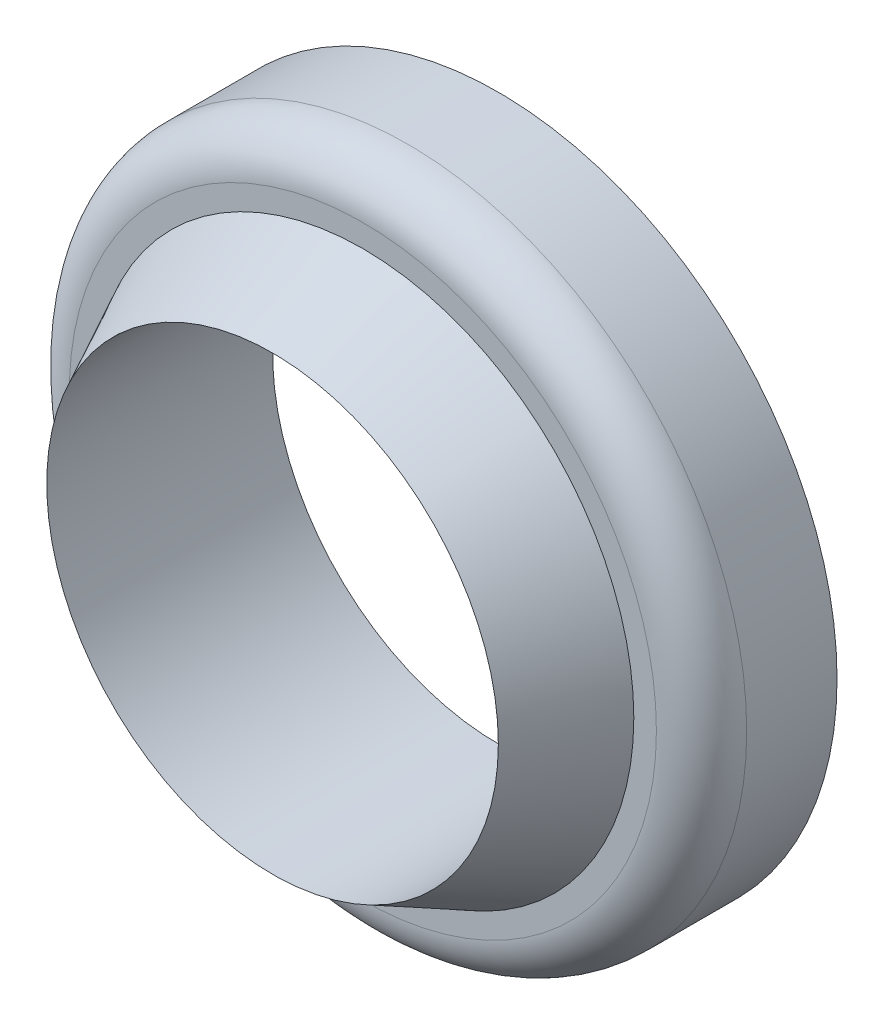
ISO-10303-21;
HEADER;
FILE_DESCRIPTION(('STEP AP214'),'2;1');
FILE_NAME('part.step','',(''),(''),'','','');
FILE_SCHEMA(('AUTOMOTIVE_DESIGN { 1 0 10303 214 1 1 1 1 }'));
ENDSEC;
DATA;
#1=APPLICATION_CONTEXT('core data for automotive mechanical design processes');
#2=APPLICATION_PROTOCOL_DEFINITION('international standard','automotive_design',2000,#1);
#3=PRODUCT_CONTEXT('',#1,'mechanical');
#4=PRODUCT('Part','Part','',(#3));
#5=PRODUCT_RELATED_PRODUCT_CATEGORY('part','',(#4));
#6=PRODUCT_DEFINITION_FORMATION('','',#4);
#7=PRODUCT_DEFINITION_CONTEXT('part definition',#1,'design');
#8=PRODUCT_DEFINITION('design','',#6,#7);
#9=PRODUCT_DEFINITION_SHAPE('','',#8);
#10=(LENGTH_UNIT() NAMED_UNIT(*) SI_UNIT(.MILLI.,.METRE.));
#11=(NAMED_UNIT(*) PLANE_ANGLE_UNIT() SI_UNIT($,.RADIAN.));
#12=(NAMED_UNIT(*) SI_UNIT($,.STERADIAN.) SOLID_ANGLE_UNIT());
#13=UNCERTAINTY_MEASURE_WITH_UNIT(LENGTH_MEASURE(1.E-05),#10,'distance_accuracy_value','');
#14=(GEOMETRIC_REPRESENTATION_CONTEXT(3) GLOBAL_UNCERTAINTY_ASSIGNED_CONTEXT((#13)) GLOBAL_UNIT_ASSIGNED_CONTEXT((#10,
#11,#12)) REPRESENTATION_CONTEXT('',''));
#15=CARTESIAN_POINT('',(0.,0.,0.));
#16=DIRECTION('',(0.,0.,1.));
#17=DIRECTION('',(1.,0.,0.));
#18=AXIS2_PLACEMENT_3D('',#15,#16,#17);
#19=CARTESIAN_POINT('',(0.,0.,48.0551555894142));
#20=DIRECTION('',(0.,0.,1.));
#21=DIRECTION('',(1.,0.,0.));
#22=AXIS2_PLACEMENT_3D('',#19,#20,#21);
#23=CYLINDRICAL_SURFACE('',#22,5.);
#24=CARTESIAN_POINT('',(0.,0.,0.));
#25=DIRECTION('',(0.,0.,1.));
#26=DIRECTION('',(1.,0.,0.));
#27=AXIS2_PLACEMENT_3D('',#24,#25,#26);
#28=CIRCLE('',#27,5.);
#29=CARTESIAN_POINT('',(5.,0.,0.));
#30=VERTEX_POINT('',#29);
#31=EDGE_CURVE('E53',#30,#30,#28,.T.);
#32=ORIENTED_EDGE('',*,*,#31,.F.);
#33=EDGE_LOOP('',(#32));
#34=FACE_BOUND('',#33,.T.);
#35=CARTESIAN_POINT('',(0.,0.,5.));
#36=DIRECTION('',(0.,0.,1.));
#37=DIRECTION('',(1.,0.,0.));
#38=AXIS2_PLACEMENT_3D('',#35,#36,#37);
#39=CIRCLE('',#38,5.);
#40=CARTESIAN_POINT('',(5.,0.,5.));
#41=VERTEX_POINT('',#40);
#42=EDGE_CURVE('E10',#41,#41,#39,.T.);
#43=ORIENTED_EDGE('',*,*,#42,.T.);
#44=EDGE_LOOP('',(#43));
#45=FACE_BOUND('',#44,.T.);
#46=ADVANCED_FACE('F31',(#34,#45),#23,.F.);
#47=CARTESIAN_POINT('',(0.,0.,3.));
#48=DIRECTION('',(0.,0.,-1.));
#49=DIRECTION('',(-1.,0.,0.));
#50=AXIS2_PLACEMENT_3D('',#47,#48,#49);
#51=CONICAL_SURFACE('',#50,6.,0.463647609000807);
#52=ORIENTED_EDGE('',*,*,#42,.F.);
#53=EDGE_LOOP('',(#52));
#54=FACE_BOUND('',#53,.T.);
#55=CARTESIAN_POINT('',(0.,0.,3.));
#56=DIRECTION('',(0.,0.,1.));
#57=DIRECTION('',(1.,0.,0.));
#58=AXIS2_PLACEMENT_3D('',#55,#56,#57);
#59=CIRCLE('',#58,6.);
#60=CARTESIAN_POINT('',(6.,0.,3.));
#61=VERTEX_POINT('',#60);
#62=EDGE_CURVE('E37',#61,#61,#59,.T.);
#63=ORIENTED_EDGE('',*,*,#62,.T.);
#64=EDGE_LOOP('',(#63));
#65=FACE_BOUND('',#64,.T.);
#66=ADVANCED_FACE('F60',(#54,#65),#51,.T.);
#67=CARTESIAN_POINT('',(0.,6.49999999999999,3.));
#68=DIRECTION('',(0.,0.,-1.));
#69=DIRECTION('',(-1.,0.,0.));
#70=AXIS2_PLACEMENT_3D('',#67,#68,#69);
#71=PLANE('',#70);
#72=ORIENTED_EDGE('',*,*,#62,.F.);
#73=EDGE_LOOP('',(#72));
#74=FACE_BOUND('',#73,.T.);
#75=CARTESIAN_POINT('',(0.,0.,3.));
#76=DIRECTION('',(0.,0.,1.));
#77=DIRECTION('',(1.,0.,0.));
#78=AXIS2_PLACEMENT_3D('',#75,#76,#77);
#79=CIRCLE('',#78,6.49999999999999);
#80=CARTESIAN_POINT('',(6.49999999999999,0.,3.));
#81=VERTEX_POINT('',#80);
#82=EDGE_CURVE('E41',#81,#81,#79,.T.);
#83=ORIENTED_EDGE('',*,*,#82,.T.);
#84=EDGE_LOOP('',(#83));
#85=FACE_BOUND('',#84,.T.);
#86=ADVANCED_FACE('F64',(#74,#85),#71,.F.);
#87=CARTESIAN_POINT('',(0.,0.,2.));
#88=DIRECTION('',(0.,0.,1.));
#89=DIRECTION('',(1.,0.,0.));
#90=AXIS2_PLACEMENT_3D('',#87,#88,#89);
#91=TOROIDAL_SURFACE('',#90,6.5,1.);
#92=ORIENTED_EDGE('',*,*,#82,.F.);
#93=EDGE_LOOP('',(#92));
#94=FACE_BOUND('',#93,.T.);
#95=CARTESIAN_POINT('',(0.,0.,1.99999999999999));
#96=DIRECTION('',(0.,0.,1.));
#97=DIRECTION('',(1.,0.,0.));
#98=AXIS2_PLACEMENT_3D('',#95,#96,#97);
#99=CIRCLE('',#98,7.5);
#100=CARTESIAN_POINT('',(7.5,0.,1.99999999999999));
#101=VERTEX_POINT('',#100);
#102=EDGE_CURVE('E45',#101,#101,#99,.T.);
#103=ORIENTED_EDGE('',*,*,#102,.T.);
#104=EDGE_LOOP('',(#103));
#105=FACE_BOUND('',#104,.T.);
#106=ADVANCED_FACE('F69',(#94,#105),#91,.T.);
#107=CARTESIAN_POINT('',(0.,0.,48.0551555894142));
#108=DIRECTION('',(0.,0.,1.));
#109=DIRECTION('',(1.,0.,0.));
#110=AXIS2_PLACEMENT_3D('',#107,#108,#109);
#111=CYLINDRICAL_SURFACE('',#110,7.5);
#112=ORIENTED_EDGE('',*,*,#102,.F.);
#113=EDGE_LOOP('',(#112));
#114=FACE_BOUND('',#113,.T.);
#115=CARTESIAN_POINT('',(0.,0.,0.));
#116=DIRECTION('',(0.,0.,1.));
#117=DIRECTION('',(1.,0.,0.));
#118=AXIS2_PLACEMENT_3D('',#115,#116,#117);
#119=CIRCLE('',#118,7.5);
#120=CARTESIAN_POINT('',(7.5,0.,0.));
#121=VERTEX_POINT('',#120);
#122=EDGE_CURVE('E50',#121,#121,#119,.T.);
#123=ORIENTED_EDGE('',*,*,#122,.T.);
#124=EDGE_LOOP('',(#123));
#125=FACE_BOUND('',#124,.T.);
#126=ADVANCED_FACE('F75',(#114,#125),#111,.T.);
#127=CARTESIAN_POINT('',(0.,5.,0.));
#128=DIRECTION('',(0.,0.,1.));
#129=DIRECTION('',(1.,0.,0.));
#130=AXIS2_PLACEMENT_3D('',#127,#128,#129);
#131=PLANE('',#130);
#132=ORIENTED_EDGE('',*,*,#122,.F.);
#133=EDGE_LOOP('',(#132));
#134=FACE_BOUND('',#133,.T.);
#135=ORIENTED_EDGE('',*,*,#31,.T.);
#136=EDGE_LOOP('',(#135));
#137=FACE_BOUND('',#136,.T.);
#138=ADVANCED_FACE('F57',(#134,#137),#131,.F.);
#139=CLOSED_SHELL('',(#46,#66,#86,#106,#126,#138));
#140=MANIFOLD_SOLID_BREP('B2',#139);
#141=ADVANCED_BREP_SHAPE_REPRESENTATION('',(#18,#140),#14);
#142=SHAPE_DEFINITION_REPRESENTATION(#9,#141);
ENDSEC;
END-ISO-10303-21;
